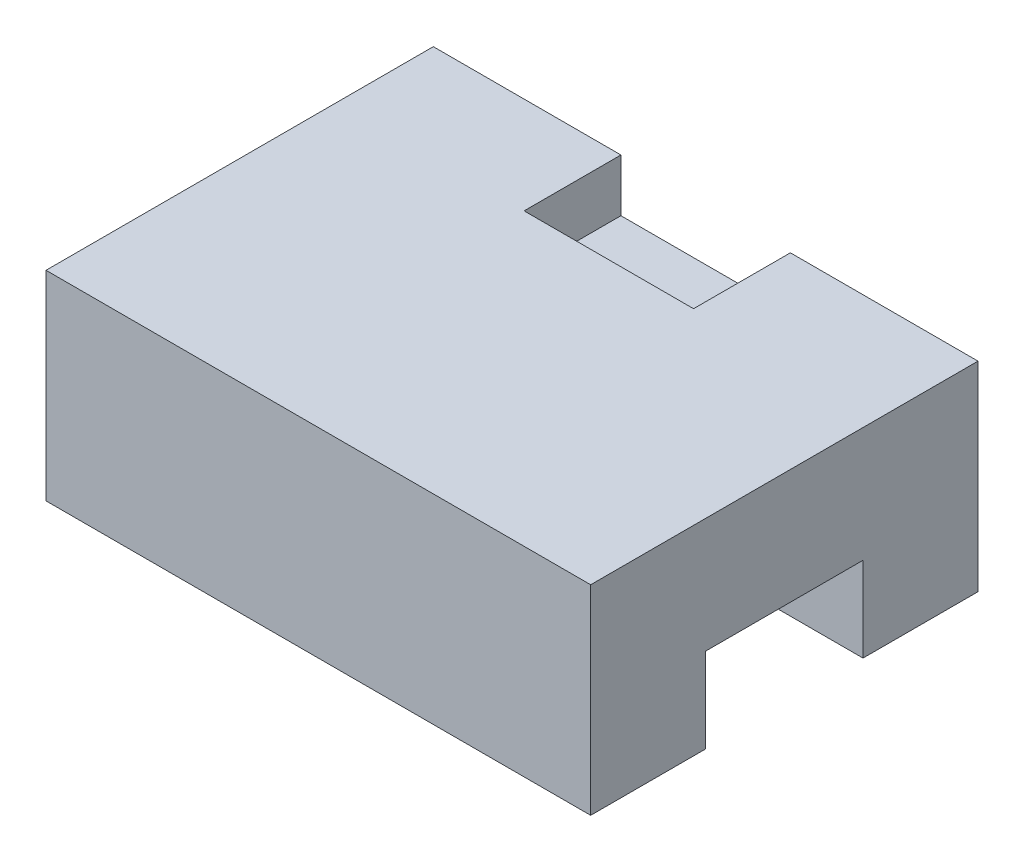
ISO-10303-21;
HEADER;
FILE_DESCRIPTION(('STEP AP214'),'2;1');
FILE_NAME('part.step','',(''),(''),'','','');
FILE_SCHEMA(('AUTOMOTIVE_DESIGN { 1 0 10303 214 1 1 1 1 }'));
ENDSEC;
DATA;
#1=APPLICATION_CONTEXT('core data for automotive mechanical design processes');
#2=APPLICATION_PROTOCOL_DEFINITION('international standard','automotive_design',2000,#1);
#3=PRODUCT_CONTEXT('',#1,'mechanical');
#4=PRODUCT('Part','Part','',(#3));
#5=PRODUCT_RELATED_PRODUCT_CATEGORY('part','',(#4));
#6=PRODUCT_DEFINITION_FORMATION('','',#4);
#7=PRODUCT_DEFINITION_CONTEXT('part definition',#1,'design');
#8=PRODUCT_DEFINITION('design','',#6,#7);
#9=PRODUCT_DEFINITION_SHAPE('','',#8);
#10=(LENGTH_UNIT() NAMED_UNIT(*) SI_UNIT(.MILLI.,.METRE.));
#11=(NAMED_UNIT(*) PLANE_ANGLE_UNIT() SI_UNIT($,.RADIAN.));
#12=(NAMED_UNIT(*) SI_UNIT($,.STERADIAN.) SOLID_ANGLE_UNIT());
#13=UNCERTAINTY_MEASURE_WITH_UNIT(LENGTH_MEASURE(1.E-05),#10,'distance_accuracy_value','');
#14=(GEOMETRIC_REPRESENTATION_CONTEXT(3) GLOBAL_UNCERTAINTY_ASSIGNED_CONTEXT((#13)) GLOBAL_UNIT_ASSIGNED_CONTEXT((#10,
#11,#12)) REPRESENTATION_CONTEXT('',''));
#15=CARTESIAN_POINT('',(0.,0.,0.));
#16=DIRECTION('',(0.,0.,1.));
#17=DIRECTION('',(1.,0.,0.));
#18=AXIS2_PLACEMENT_3D('',#15,#16,#17);
#19=CARTESIAN_POINT('',(-64.35,-16.1464285714286,-64.));
#20=DIRECTION('',(0.,-1.,0.));
#21=DIRECTION('',(0.,0.,-1.));
#22=AXIS2_PLACEMENT_3D('',#19,#20,#21);
#23=PLANE('',#22);
#24=DIRECTION('',(1.,0.,0.));
#25=VECTOR('',#24,1.);
#26=CARTESIAN_POINT('',(-64.351,-16.1464285714286,-19.));
#27=LINE('',#26,#25);
#28=CARTESIAN_POINT('',(-64.35,-16.1464285714286,-19.));
#29=VERTEX_POINT('',#28);
#30=CARTESIAN_POINT('',(25.65,-16.1464285714286,-19.));
#31=VERTEX_POINT('',#30);
#32=EDGE_CURVE('E172',#29,#31,#27,.T.);
#33=ORIENTED_EDGE('',*,*,#32,.T.);
#34=DIRECTION('',(0.,0.,1.));
#35=VECTOR('',#34,1.);
#36=CARTESIAN_POINT('',(25.65,-16.1464285714286,-64.));
#37=LINE('',#36,#35);
#38=CARTESIAN_POINT('',(25.65,-16.1464285714286,0.));
#39=VERTEX_POINT('',#38);
#40=EDGE_CURVE('E207',#31,#39,#37,.T.);
#41=ORIENTED_EDGE('',*,*,#40,.T.);
#42=DIRECTION('',(1.,0.,0.));
#43=VECTOR('',#42,1.);
#44=CARTESIAN_POINT('',(-64.35,-16.1464285714286,0.));
#45=LINE('',#44,#43);
#46=CARTESIAN_POINT('',(-64.35,-16.1464285714286,0.));
#47=VERTEX_POINT('',#46);
#48=EDGE_CURVE('E197',#47,#39,#45,.T.);
#49=ORIENTED_EDGE('',*,*,#48,.F.);
#50=DIRECTION('',(0.,0.,1.));
#51=VECTOR('',#50,1.);
#52=CARTESIAN_POINT('',(-64.35,-16.1464285714286,-64.));
#53=LINE('',#52,#51);
#54=EDGE_CURVE('E194',#29,#47,#53,.T.);
#55=ORIENTED_EDGE('',*,*,#54,.F.);
#56=EDGE_LOOP('',(#33,#41,#49,#55));
#57=FACE_BOUND('',#56,.T.);
#58=ADVANCED_FACE('F37',(#57),#23,.T.);
#59=CARTESIAN_POINT('',(-64.35,16.8535714285714,-64.));
#60=DIRECTION('',(-1.,0.,0.));
#61=DIRECTION('',(0.,0.,1.));
#62=AXIS2_PLACEMENT_3D('',#59,#60,#61);
#63=PLANE('',#62);
#64=DIRECTION('',(0.,-1.,0.));
#65=VECTOR('',#64,1.);
#66=CARTESIAN_POINT('',(-64.35,-16.1464285714286,-19.));
#67=LINE('',#66,#65);
#68=CARTESIAN_POINT('',(-64.35,-2.14642857142858,-19.));
#69=VERTEX_POINT('',#68);
#70=EDGE_CURVE('E159',#69,#29,#67,.T.);
#71=ORIENTED_EDGE('',*,*,#70,.T.);
#72=ORIENTED_EDGE('',*,*,#54,.T.);
#73=DIRECTION('',(0.,-1.,0.));
#74=VECTOR('',#73,1.);
#75=CARTESIAN_POINT('',(-64.35,16.8535714285714,0.));
#76=LINE('',#75,#74);
#77=CARTESIAN_POINT('',(-64.35,16.8535714285714,0.));
#78=VERTEX_POINT('',#77);
#79=EDGE_CURVE('E181',#78,#47,#76,.T.);
#80=ORIENTED_EDGE('',*,*,#79,.F.);
#81=DIRECTION('',(0.,0.,1.));
#82=VECTOR('',#81,1.);
#83=CARTESIAN_POINT('',(-64.35,16.8535714285714,-64.));
#84=LINE('',#83,#82);
#85=CARTESIAN_POINT('',(-64.35,16.8535714285714,-64.));
#86=VERTEX_POINT('',#85);
#87=EDGE_CURVE('E11',#86,#78,#84,.T.);
#88=ORIENTED_EDGE('',*,*,#87,.F.);
#89=DIRECTION('',(0.,-1.,0.));
#90=VECTOR('',#89,1.);
#91=CARTESIAN_POINT('',(-64.35,16.8535714285714,-64.));
#92=LINE('',#91,#90);
#93=CARTESIAN_POINT('',(-64.35,-16.1464285714286,-64.));
#94=VERTEX_POINT('',#93);
#95=EDGE_CURVE('E182',#86,#94,#92,.T.);
#96=ORIENTED_EDGE('',*,*,#95,.T.);
#97=CARTESIAN_POINT('',(-64.35,-16.1464285714286,-45.));
#98=VERTEX_POINT('',#97);
#99=EDGE_CURVE('E41',#94,#98,#53,.T.);
#100=ORIENTED_EDGE('',*,*,#99,.T.);
#101=DIRECTION('',(0.,1.,0.));
#102=VECTOR('',#101,1.);
#103=CARTESIAN_POINT('',(-64.35,-2.14642857142858,-45.));
#104=LINE('',#103,#102);
#105=CARTESIAN_POINT('',(-64.35,-2.14642857142858,-45.));
#106=VERTEX_POINT('',#105);
#107=EDGE_CURVE('E62',#98,#106,#104,.T.);
#108=ORIENTED_EDGE('',*,*,#107,.T.);
#109=DIRECTION('',(0.,0.,1.));
#110=VECTOR('',#109,1.);
#111=CARTESIAN_POINT('',(-64.35,-2.14642857142858,-19.));
#112=LINE('',#111,#110);
#113=EDGE_CURVE('E156',#106,#69,#112,.T.);
#114=ORIENTED_EDGE('',*,*,#113,.T.);
#115=EDGE_LOOP('',(#71,#72,#80,#88,#96,#100,#108,#114));
#116=FACE_BOUND('',#115,.T.);
#117=ADVANCED_FACE('F39',(#116),#63,.T.);
#118=CARTESIAN_POINT('',(-64.35,16.8535714285714,-64.));
#119=DIRECTION('',(0.,1.,0.));
#120=DIRECTION('',(0.,0.,1.));
#121=AXIS2_PLACEMENT_3D('',#118,#119,#120);
#122=PLANE('',#121);
#123=DIRECTION('',(0.,0.,-1.));
#124=VECTOR('',#123,1.);
#125=CARTESIAN_POINT('',(-33.35,16.8535714285714,-48.));
#126=LINE('',#125,#124);
#127=CARTESIAN_POINT('',(-33.35,16.8535714285714,-48.));
#128=VERTEX_POINT('',#127);
#129=CARTESIAN_POINT('',(-33.35,16.8535714285714,-64.));
#130=VERTEX_POINT('',#129);
#131=EDGE_CURVE('E160',#128,#130,#126,.T.);
#132=ORIENTED_EDGE('',*,*,#131,.T.);
#133=DIRECTION('',(-1.,0.,0.));
#134=VECTOR('',#133,1.);
#135=CARTESIAN_POINT('',(-64.35,16.8535714285714,-64.));
#136=LINE('',#135,#134);
#137=EDGE_CURVE('E192',#130,#86,#136,.T.);
#138=ORIENTED_EDGE('',*,*,#137,.T.);
#139=ORIENTED_EDGE('',*,*,#87,.T.);
#140=DIRECTION('',(-1.,0.,0.));
#141=VECTOR('',#140,1.);
#142=CARTESIAN_POINT('',(-64.35,16.8535714285714,0.));
#143=LINE('',#142,#141);
#144=CARTESIAN_POINT('',(25.65,16.8535714285714,0.));
#145=VERTEX_POINT('',#144);
#146=EDGE_CURVE('E186',#145,#78,#143,.T.);
#147=ORIENTED_EDGE('',*,*,#146,.F.);
#148=DIRECTION('',(0.,0.,1.));
#149=VECTOR('',#148,1.);
#150=CARTESIAN_POINT('',(25.65,16.8535714285714,-64.));
#151=LINE('',#150,#149);
#152=CARTESIAN_POINT('',(25.65,16.8535714285714,-64.));
#153=VERTEX_POINT('',#152);
#154=EDGE_CURVE('E46',#153,#145,#151,.T.);
#155=ORIENTED_EDGE('',*,*,#154,.F.);
#156=CARTESIAN_POINT('',(-5.35000000000004,16.8535714285714,-64.));
#157=VERTEX_POINT('',#156);
#158=EDGE_CURVE('E149',#153,#157,#136,.T.);
#159=ORIENTED_EDGE('',*,*,#158,.T.);
#160=DIRECTION('',(0.,0.,-1.));
#161=VECTOR('',#160,1.);
#162=CARTESIAN_POINT('',(-5.35000000000002,16.8535714285714,-48.));
#163=LINE('',#162,#161);
#164=CARTESIAN_POINT('',(-5.35000000000002,16.8535714285714,-48.));
#165=VERTEX_POINT('',#164);
#166=EDGE_CURVE('E54',#165,#157,#163,.T.);
#167=ORIENTED_EDGE('',*,*,#166,.F.);
#168=DIRECTION('',(1.,0.,0.));
#169=VECTOR('',#168,1.);
#170=CARTESIAN_POINT('',(-33.35,16.8535714285714,-48.));
#171=LINE('',#170,#169);
#172=EDGE_CURVE('E135',#128,#165,#171,.T.);
#173=ORIENTED_EDGE('',*,*,#172,.F.);
#174=EDGE_LOOP('',(#132,#138,#139,#147,#155,#159,#167,#173));
#175=FACE_BOUND('',#174,.T.);
#176=ADVANCED_FACE('F147',(#175),#122,.T.);
#177=CARTESIAN_POINT('',(25.65,16.8535714285714,-64.));
#178=DIRECTION('',(1.,0.,0.));
#179=DIRECTION('',(0.,0.,-1.));
#180=AXIS2_PLACEMENT_3D('',#177,#178,#179);
#181=PLANE('',#180);
#182=DIRECTION('',(0.,-1.,0.));
#183=VECTOR('',#182,1.);
#184=CARTESIAN_POINT('',(25.65,-16.1464285714286,-19.));
#185=LINE('',#184,#183);
#186=CARTESIAN_POINT('',(25.65,-2.14642857142858,-19.));
#187=VERTEX_POINT('',#186);
#188=EDGE_CURVE('E169',#187,#31,#185,.T.);
#189=ORIENTED_EDGE('',*,*,#188,.F.);
#190=DIRECTION('',(0.,0.,1.));
#191=VECTOR('',#190,1.);
#192=CARTESIAN_POINT('',(25.65,-2.14642857142858,-19.));
#193=LINE('',#192,#191);
#194=CARTESIAN_POINT('',(25.65,-2.14642857142858,-45.));
#195=VERTEX_POINT('',#194);
#196=EDGE_CURVE('E166',#195,#187,#193,.T.);
#197=ORIENTED_EDGE('',*,*,#196,.F.);
#198=DIRECTION('',(0.,1.,0.));
#199=VECTOR('',#198,1.);
#200=CARTESIAN_POINT('',(25.65,-2.14642857142858,-45.));
#201=LINE('',#200,#199);
#202=CARTESIAN_POINT('',(25.65,-16.1464285714286,-45.));
#203=VERTEX_POINT('',#202);
#204=EDGE_CURVE('E163',#203,#195,#201,.T.);
#205=ORIENTED_EDGE('',*,*,#204,.F.);
#206=CARTESIAN_POINT('',(25.65,-16.1464285714286,-64.));
#207=VERTEX_POINT('',#206);
#208=EDGE_CURVE('E205',#207,#203,#37,.T.);
#209=ORIENTED_EDGE('',*,*,#208,.F.);
#210=DIRECTION('',(0.,1.,0.));
#211=VECTOR('',#210,1.);
#212=CARTESIAN_POINT('',(25.65,16.8535714285714,-64.));
#213=LINE('',#212,#211);
#214=EDGE_CURVE('E189',#207,#153,#213,.T.);
#215=ORIENTED_EDGE('',*,*,#214,.T.);
#216=ORIENTED_EDGE('',*,*,#154,.T.);
#217=DIRECTION('',(0.,1.,0.));
#218=VECTOR('',#217,1.);
#219=CARTESIAN_POINT('',(25.65,16.8535714285714,0.));
#220=LINE('',#219,#218);
#221=EDGE_CURVE('E200',#39,#145,#220,.T.);
#222=ORIENTED_EDGE('',*,*,#221,.F.);
#223=ORIENTED_EDGE('',*,*,#40,.F.);
#224=EDGE_LOOP('',(#189,#197,#205,#209,#215,#216,#222,#223));
#225=FACE_BOUND('',#224,.T.);
#226=ADVANCED_FACE('F234',(#225),#181,.T.);
#227=DIRECTION('',(1.,0.,0.));
#228=VECTOR('',#227,1.);
#229=CARTESIAN_POINT('',(-64.351,-16.1464285714286,-45.));
#230=LINE('',#229,#228);
#231=EDGE_CURVE('E171',#98,#203,#230,.T.);
#232=ORIENTED_EDGE('',*,*,#231,.F.);
#233=ORIENTED_EDGE('',*,*,#99,.F.);
#234=DIRECTION('',(1.,0.,0.));
#235=VECTOR('',#234,1.);
#236=CARTESIAN_POINT('',(-64.35,-16.1464285714286,-64.));
#237=LINE('',#236,#235);
#238=EDGE_CURVE('E185',#94,#207,#237,.T.);
#239=ORIENTED_EDGE('',*,*,#238,.T.);
#240=ORIENTED_EDGE('',*,*,#208,.T.);
#241=EDGE_LOOP('',(#232,#233,#239,#240));
#242=FACE_BOUND('',#241,.T.);
#243=ADVANCED_FACE('F228',(#242),#23,.T.);
#244=CARTESIAN_POINT('',(0.,0.,-64.));
#245=DIRECTION('',(0.,0.,1.));
#246=DIRECTION('',(1.,0.,0.));
#247=AXIS2_PLACEMENT_3D('',#244,#245,#246);
#248=PLANE('',#247);
#249=ORIENTED_EDGE('',*,*,#137,.F.);
#250=DIRECTION('',(0.,1.,0.));
#251=VECTOR('',#250,1.);
#252=CARTESIAN_POINT('',(-33.35,8.16093326160442,-64.));
#253=LINE('',#252,#251);
#254=CARTESIAN_POINT('',(-33.35,8.16093326160442,-64.));
#255=VERTEX_POINT('',#254);
#256=EDGE_CURVE('E144',#255,#130,#253,.T.);
#257=ORIENTED_EDGE('',*,*,#256,.F.);
#258=DIRECTION('',(-1.,0.,0.));
#259=VECTOR('',#258,1.);
#260=CARTESIAN_POINT('',(-5.35000000000002,8.16093326160442,-64.));
#261=LINE('',#260,#259);
#262=CARTESIAN_POINT('',(-5.35000000000002,8.16093326160442,-64.));
#263=VERTEX_POINT('',#262);
#264=EDGE_CURVE('E243',#263,#255,#261,.T.);
#265=ORIENTED_EDGE('',*,*,#264,.F.);
#266=DIRECTION('',(0.,-1.,0.));
#267=VECTOR('',#266,1.);
#268=CARTESIAN_POINT('',(-5.35000000000002,16.8535714285714,-64.));
#269=LINE('',#268,#267);
#270=EDGE_CURVE('E241',#157,#263,#269,.T.);
#271=ORIENTED_EDGE('',*,*,#270,.F.);
#272=ORIENTED_EDGE('',*,*,#158,.F.);
#273=ORIENTED_EDGE('',*,*,#214,.F.);
#274=ORIENTED_EDGE('',*,*,#238,.F.);
#275=ORIENTED_EDGE('',*,*,#95,.F.);
#276=EDGE_LOOP('',(#249,#257,#265,#271,#272,#273,#274,#275));
#277=FACE_BOUND('',#276,.T.);
#278=ADVANCED_FACE('F225',(#277),#248,.F.);
#279=CARTESIAN_POINT('',(0.,0.,0.));
#280=DIRECTION('',(0.,0.,1.));
#281=DIRECTION('',(1.,0.,0.));
#282=AXIS2_PLACEMENT_3D('',#279,#280,#281);
#283=PLANE('',#282);
#284=ORIENTED_EDGE('',*,*,#79,.T.);
#285=ORIENTED_EDGE('',*,*,#48,.T.);
#286=ORIENTED_EDGE('',*,*,#221,.T.);
#287=ORIENTED_EDGE('',*,*,#146,.T.);
#288=EDGE_LOOP('',(#284,#285,#286,#287));
#289=FACE_BOUND('',#288,.T.);
#290=ADVANCED_FACE('F219',(#289),#283,.T.);
#291=CARTESIAN_POINT('',(-64.351,-16.1464285714286,-19.));
#292=DIRECTION('',(0.,0.,1.));
#293=DIRECTION('',(1.,0.,0.));
#294=AXIS2_PLACEMENT_3D('',#291,#292,#293);
#295=PLANE('',#294);
#296=DIRECTION('',(1.,0.,0.));
#297=VECTOR('',#296,1.);
#298=CARTESIAN_POINT('',(-64.351,-2.14642857142858,-19.));
#299=LINE('',#298,#297);
#300=EDGE_CURVE('E175',#69,#187,#299,.T.);
#301=ORIENTED_EDGE('',*,*,#300,.T.);
#302=ORIENTED_EDGE('',*,*,#188,.T.);
#303=ORIENTED_EDGE('',*,*,#32,.F.);
#304=ORIENTED_EDGE('',*,*,#70,.F.);
#305=EDGE_LOOP('',(#301,#302,#303,#304));
#306=FACE_BOUND('',#305,.T.);
#307=ADVANCED_FACE('F239',(#306),#295,.F.);
#308=CARTESIAN_POINT('',(-64.351,-2.14642857142858,-19.));
#309=DIRECTION('',(0.,1.,0.));
#310=DIRECTION('',(0.,0.,1.));
#311=AXIS2_PLACEMENT_3D('',#308,#309,#310);
#312=PLANE('',#311);
#313=DIRECTION('',(1.,0.,0.));
#314=VECTOR('',#313,1.);
#315=CARTESIAN_POINT('',(-64.351,-2.14642857142858,-45.));
#316=LINE('',#315,#314);
#317=EDGE_CURVE('E177',#106,#195,#316,.T.);
#318=ORIENTED_EDGE('',*,*,#317,.T.);
#319=ORIENTED_EDGE('',*,*,#196,.T.);
#320=ORIENTED_EDGE('',*,*,#300,.F.);
#321=ORIENTED_EDGE('',*,*,#113,.F.);
#322=EDGE_LOOP('',(#318,#319,#320,#321));
#323=FACE_BOUND('',#322,.T.);
#324=ADVANCED_FACE('F237',(#323),#312,.F.);
#325=CARTESIAN_POINT('',(-64.351,-2.14642857142858,-45.));
#326=DIRECTION('',(0.,0.,-1.));
#327=DIRECTION('',(-1.,0.,0.));
#328=AXIS2_PLACEMENT_3D('',#325,#326,#327);
#329=PLANE('',#328);
#330=ORIENTED_EDGE('',*,*,#231,.T.);
#331=ORIENTED_EDGE('',*,*,#204,.T.);
#332=ORIENTED_EDGE('',*,*,#317,.F.);
#333=ORIENTED_EDGE('',*,*,#107,.F.);
#334=EDGE_LOOP('',(#330,#331,#332,#333));
#335=FACE_BOUND('',#334,.T.);
#336=ADVANCED_FACE('F230',(#335),#329,.F.);
#337=CARTESIAN_POINT('',(-33.35,8.16093326160442,-48.));
#338=DIRECTION('',(-1.,0.,0.));
#339=DIRECTION('',(0.,0.,1.));
#340=AXIS2_PLACEMENT_3D('',#337,#338,#339);
#341=PLANE('',#340);
#342=ORIENTED_EDGE('',*,*,#256,.T.);
#343=ORIENTED_EDGE('',*,*,#131,.F.);
#344=DIRECTION('',(0.,1.,0.));
#345=VECTOR('',#344,1.);
#346=CARTESIAN_POINT('',(-33.35,8.16093326160442,-48.));
#347=LINE('',#346,#345);
#348=CARTESIAN_POINT('',(-33.35,8.16093326160442,-48.));
#349=VERTEX_POINT('',#348);
#350=EDGE_CURVE('E141',#349,#128,#347,.T.);
#351=ORIENTED_EDGE('',*,*,#350,.F.);
#352=DIRECTION('',(0.,0.,-1.));
#353=VECTOR('',#352,1.);
#354=CARTESIAN_POINT('',(-33.35,8.16093326160442,-48.));
#355=LINE('',#354,#353);
#356=EDGE_CURVE('E151',#349,#255,#355,.T.);
#357=ORIENTED_EDGE('',*,*,#356,.T.);
#358=EDGE_LOOP('',(#342,#343,#351,#357));
#359=FACE_BOUND('',#358,.T.);
#360=ADVANCED_FACE('F250',(#359),#341,.F.);
#361=CARTESIAN_POINT('',(-5.35000000000002,8.16093326160442,-48.));
#362=DIRECTION('',(0.,-1.,0.));
#363=DIRECTION('',(0.,0.,-1.));
#364=AXIS2_PLACEMENT_3D('',#361,#362,#363);
#365=PLANE('',#364);
#366=ORIENTED_EDGE('',*,*,#264,.T.);
#367=ORIENTED_EDGE('',*,*,#356,.F.);
#368=DIRECTION('',(-1.,0.,0.));
#369=VECTOR('',#368,1.);
#370=CARTESIAN_POINT('',(-5.35000000000002,8.16093326160442,-48.));
#371=LINE('',#370,#369);
#372=CARTESIAN_POINT('',(-5.35000000000002,8.16093326160442,-48.));
#373=VERTEX_POINT('',#372);
#374=EDGE_CURVE('E134',#373,#349,#371,.T.);
#375=ORIENTED_EDGE('',*,*,#374,.F.);
#376=DIRECTION('',(0.,0.,-1.));
#377=VECTOR('',#376,1.);
#378=CARTESIAN_POINT('',(-5.35000000000002,8.16093326160442,-48.));
#379=LINE('',#378,#377);
#380=EDGE_CURVE('E130',#373,#263,#379,.T.);
#381=ORIENTED_EDGE('',*,*,#380,.T.);
#382=EDGE_LOOP('',(#366,#367,#375,#381));
#383=FACE_BOUND('',#382,.T.);
#384=ADVANCED_FACE('F252',(#383),#365,.F.);
#385=CARTESIAN_POINT('',(-5.35000000000002,16.8535714285714,-48.));
#386=DIRECTION('',(1.,0.,0.));
#387=DIRECTION('',(0.,1.,0.));
#388=AXIS2_PLACEMENT_3D('',#385,#386,#387);
#389=PLANE('',#388);
#390=ORIENTED_EDGE('',*,*,#270,.T.);
#391=ORIENTED_EDGE('',*,*,#380,.F.);
#392=DIRECTION('',(0.,-1.,0.));
#393=VECTOR('',#392,1.);
#394=CARTESIAN_POINT('',(-5.35000000000002,16.8535714285714,-48.));
#395=LINE('',#394,#393);
#396=EDGE_CURVE('E127',#165,#373,#395,.T.);
#397=ORIENTED_EDGE('',*,*,#396,.F.);
#398=ORIENTED_EDGE('',*,*,#166,.T.);
#399=EDGE_LOOP('',(#390,#391,#397,#398));
#400=FACE_BOUND('',#399,.T.);
#401=ADVANCED_FACE('F129',(#400),#389,.F.);
#402=CARTESIAN_POINT('',(0.,0.,-48.));
#403=DIRECTION('',(0.,0.,-1.));
#404=DIRECTION('',(-1.,0.,0.));
#405=AXIS2_PLACEMENT_3D('',#402,#403,#404);
#406=PLANE('',#405);
#407=ORIENTED_EDGE('',*,*,#172,.T.);
#408=ORIENTED_EDGE('',*,*,#396,.T.);
#409=ORIENTED_EDGE('',*,*,#374,.T.);
#410=ORIENTED_EDGE('',*,*,#350,.T.);
#411=EDGE_LOOP('',(#407,#408,#409,#410));
#412=FACE_BOUND('',#411,.T.);
#413=ADVANCED_FACE('F139',(#412),#406,.T.);
#414=CLOSED_SHELL('',(#58,#117,#176,#226,#243,#278,#290,#307,#324,#336,#360,#384,#401,#413));
#415=MANIFOLD_SOLID_BREP('B2',#414);
#416=ADVANCED_BREP_SHAPE_REPRESENTATION('',(#18,#415),#14);
#417=SHAPE_DEFINITION_REPRESENTATION(#9,#416);
ENDSEC;
END-ISO-10303-21;
